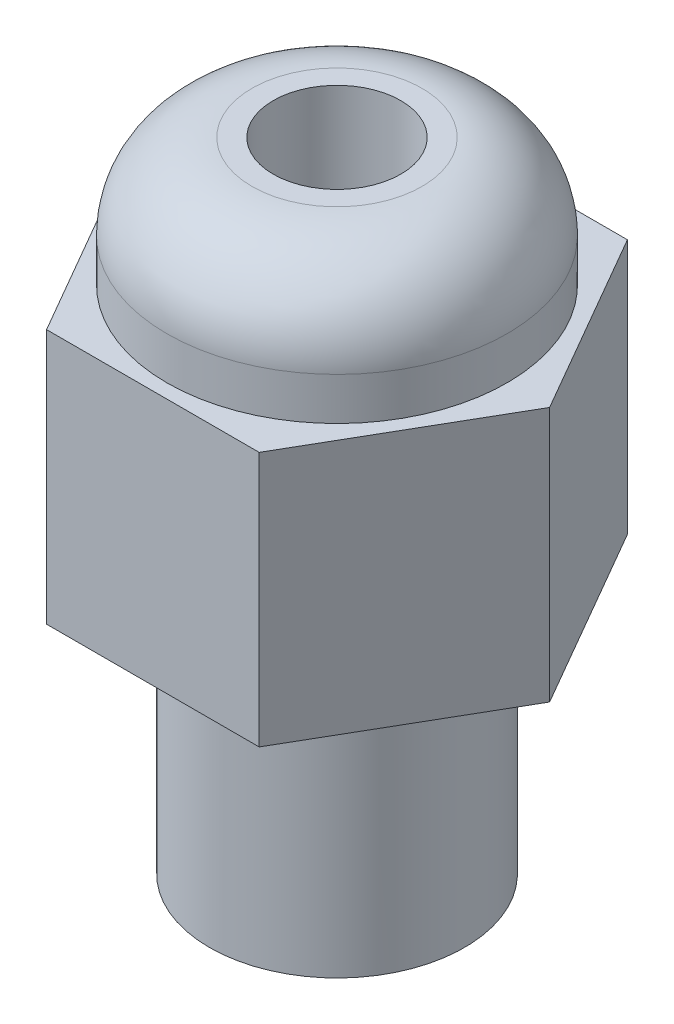
ISO-10303-21;
HEADER;
FILE_DESCRIPTION(('STEP AP214'),'2;1');
FILE_NAME('part.step','',(''),(''),'','','');
FILE_SCHEMA(('AUTOMOTIVE_DESIGN { 1 0 10303 214 1 1 1 1 }'));
ENDSEC;
DATA;
#1=APPLICATION_CONTEXT('core data for automotive mechanical design processes');
#2=APPLICATION_PROTOCOL_DEFINITION('international standard','automotive_design',2000,#1);
#3=PRODUCT_CONTEXT('',#1,'mechanical');
#4=PRODUCT('Part','Part','',(#3));
#5=PRODUCT_RELATED_PRODUCT_CATEGORY('part','',(#4));
#6=PRODUCT_DEFINITION_FORMATION('','',#4);
#7=PRODUCT_DEFINITION_CONTEXT('part definition',#1,'design');
#8=PRODUCT_DEFINITION('design','',#6,#7);
#9=PRODUCT_DEFINITION_SHAPE('','',#8);
#10=(LENGTH_UNIT() NAMED_UNIT(*) SI_UNIT(.MILLI.,.METRE.));
#11=(NAMED_UNIT(*) PLANE_ANGLE_UNIT() SI_UNIT($,.RADIAN.));
#12=(NAMED_UNIT(*) SI_UNIT($,.STERADIAN.) SOLID_ANGLE_UNIT());
#13=UNCERTAINTY_MEASURE_WITH_UNIT(LENGTH_MEASURE(1.E-05),#10,'distance_accuracy_value','');
#14=(GEOMETRIC_REPRESENTATION_CONTEXT(3) GLOBAL_UNCERTAINTY_ASSIGNED_CONTEXT((#13)) GLOBAL_UNIT_ASSIGNED_CONTEXT((#10,
#11,#12)) REPRESENTATION_CONTEXT('',''));
#15=CARTESIAN_POINT('',(0.,0.,0.));
#16=DIRECTION('',(0.,0.,1.));
#17=DIRECTION('',(1.,0.,0.));
#18=AXIS2_PLACEMENT_3D('',#15,#16,#17);
#19=CARTESIAN_POINT('',(0.,0.,0.));
#20=DIRECTION('',(0.,1.,0.));
#21=DIRECTION('',(0.,0.,1.));
#22=AXIS2_PLACEMENT_3D('',#19,#20,#21);
#23=PLANE('',#22);
#24=DIRECTION('',(0.499999999999995,0.,-0.866025403784441));
#25=VECTOR('',#24,1.);
#26=CARTESIAN_POINT('',(2.50000000000005,0.,4.33012701892216));
#27=LINE('',#26,#25);
#28=CARTESIAN_POINT('',(2.50000000000005,0.,4.33012701892216));
#29=VERTEX_POINT('',#28);
#30=CARTESIAN_POINT('',(4.99999999999999,0.,0.));
#31=VERTEX_POINT('',#30);
#32=EDGE_CURVE('E120',#29,#31,#27,.T.);
#33=ORIENTED_EDGE('',*,*,#32,.F.);
#34=DIRECTION('',(1.,0.,0.));
#35=VECTOR('',#34,1.);
#36=CARTESIAN_POINT('',(-2.49999999999995,0.,4.33012701892221));
#37=LINE('',#36,#35);
#38=CARTESIAN_POINT('',(-2.49999999999995,0.,4.33012701892221));
#39=VERTEX_POINT('',#38);
#40=EDGE_CURVE('E79',#39,#29,#37,.T.);
#41=ORIENTED_EDGE('',*,*,#40,.F.);
#42=DIRECTION('',(0.500000000000007,0.,0.866025403784435));
#43=VECTOR('',#42,1.);
#44=CARTESIAN_POINT('',(-4.99999999999999,0.,0.));
#45=LINE('',#44,#43);
#46=CARTESIAN_POINT('',(-4.99999999999999,0.,0.));
#47=VERTEX_POINT('',#46);
#48=EDGE_CURVE('E73',#47,#39,#45,.T.);
#49=ORIENTED_EDGE('',*,*,#48,.F.);
#50=DIRECTION('',(-0.499999999999995,0.,0.866025403784442));
#51=VECTOR('',#50,1.);
#52=CARTESIAN_POINT('',(-2.50000000000001,0.,-4.33012701892217));
#53=LINE('',#52,#51);
#54=CARTESIAN_POINT('',(-2.50000000000001,0.,-4.33012701892217));
#55=VERTEX_POINT('',#54);
#56=EDGE_CURVE('E110',#55,#47,#53,.T.);
#57=ORIENTED_EDGE('',*,*,#56,.F.);
#58=DIRECTION('',(-1.,0.,0.));
#59=VECTOR('',#58,1.);
#60=CARTESIAN_POINT('',(2.49999999999998,0.,-4.33012701892219));
#61=LINE('',#60,#59);
#62=CARTESIAN_POINT('',(2.49999999999998,0.,-4.33012701892219));
#63=VERTEX_POINT('',#62);
#64=EDGE_CURVE('E126',#63,#55,#61,.T.);
#65=ORIENTED_EDGE('',*,*,#64,.F.);
#66=DIRECTION('',(-0.500000000000001,0.,-0.866025403784438));
#67=VECTOR('',#66,1.);
#68=CARTESIAN_POINT('',(4.99999999999999,0.,0.));
#69=LINE('',#68,#67);
#70=EDGE_CURVE('E123',#31,#63,#69,.T.);
#71=ORIENTED_EDGE('',*,*,#70,.F.);
#72=EDGE_LOOP('',(#33,#41,#49,#57,#65,#71));
#73=FACE_BOUND('',#72,.T.);
#74=CARTESIAN_POINT('',(0.,0.,0.));
#75=DIRECTION('',(0.,1.,0.));
#76=DIRECTION('',(0.,0.,1.));
#77=AXIS2_PLACEMENT_3D('',#74,#75,#76);
#78=CIRCLE('',#77,3.);
#79=CARTESIAN_POINT('',(0.,0.,3.));
#80=VERTEX_POINT('',#79);
#81=EDGE_CURVE('E11',#80,#80,#78,.F.);
#82=ORIENTED_EDGE('',*,*,#81,.F.);
#83=EDGE_LOOP('',(#82));
#84=FACE_BOUND('',#83,.T.);
#85=ADVANCED_FACE('F33',(#73,#84),#23,.F.);
#86=CARTESIAN_POINT('',(0.,7.,0.));
#87=DIRECTION('',(0.,1.,0.));
#88=DIRECTION('',(0.,0.,1.));
#89=AXIS2_PLACEMENT_3D('',#86,#87,#88);
#90=DEGENERATE_TOROIDAL_SURFACE('',#89,2.,2.,.T.);
#91=CARTESIAN_POINT('',(0.,9.,0.));
#92=DIRECTION('',(0.,1.,0.));
#93=DIRECTION('',(0.,0.,1.));
#94=AXIS2_PLACEMENT_3D('',#91,#92,#93);
#95=CIRCLE('',#94,2.);
#96=CARTESIAN_POINT('',(0.,9.,2.));
#97=VERTEX_POINT('',#96);
#98=EDGE_CURVE('E140',#97,#97,#95,.T.);
#99=ORIENTED_EDGE('',*,*,#98,.F.);
#100=EDGE_LOOP('',(#99));
#101=FACE_BOUND('',#100,.T.);
#102=CARTESIAN_POINT('',(0.,7.,0.));
#103=DIRECTION('',(0.,1.,0.));
#104=DIRECTION('',(0.,0.,1.));
#105=AXIS2_PLACEMENT_3D('',#102,#103,#104);
#106=CIRCLE('',#105,4.);
#107=CARTESIAN_POINT('',(0.,7.,4.));
#108=VERTEX_POINT('',#107);
#109=EDGE_CURVE('E42',#108,#108,#106,.F.);
#110=ORIENTED_EDGE('',*,*,#109,.F.);
#111=EDGE_LOOP('',(#110));
#112=FACE_BOUND('',#111,.T.);
#113=ADVANCED_FACE('F35',(#101,#112),#90,.T.);
#114=CARTESIAN_POINT('',(0.,6.,0.));
#115=DIRECTION('',(0.,1.,0.));
#116=DIRECTION('',(0.,0.,1.));
#117=AXIS2_PLACEMENT_3D('',#114,#115,#116);
#118=PLANE('',#117);
#119=DIRECTION('',(0.499999999999995,0.,-0.866025403784441));
#120=VECTOR('',#119,1.);
#121=CARTESIAN_POINT('',(2.50000000000005,6.,4.33012701892216));
#122=LINE('',#121,#120);
#123=CARTESIAN_POINT('',(2.50000000000005,6.,4.33012701892216));
#124=VERTEX_POINT('',#123);
#125=CARTESIAN_POINT('',(4.99999999999999,6.,0.));
#126=VERTEX_POINT('',#125);
#127=EDGE_CURVE('E131',#124,#126,#122,.T.);
#128=ORIENTED_EDGE('',*,*,#127,.T.);
#129=DIRECTION('',(-0.500000000000001,0.,-0.866025403784438));
#130=VECTOR('',#129,1.);
#131=CARTESIAN_POINT('',(4.99999999999999,6.,0.));
#132=LINE('',#131,#130);
#133=CARTESIAN_POINT('',(2.49999999999998,6.,-4.33012701892219));
#134=VERTEX_POINT('',#133);
#135=EDGE_CURVE('E88',#126,#134,#132,.T.);
#136=ORIENTED_EDGE('',*,*,#135,.T.);
#137=DIRECTION('',(-1.,0.,0.));
#138=VECTOR('',#137,1.);
#139=CARTESIAN_POINT('',(2.49999999999998,6.,-4.33012701892219));
#140=LINE('',#139,#138);
#141=CARTESIAN_POINT('',(-2.50000000000001,6.,-4.33012701892217));
#142=VERTEX_POINT('',#141);
#143=EDGE_CURVE('E102',#134,#142,#140,.T.);
#144=ORIENTED_EDGE('',*,*,#143,.T.);
#145=DIRECTION('',(-0.499999999999995,0.,0.866025403784442));
#146=VECTOR('',#145,1.);
#147=CARTESIAN_POINT('',(-2.50000000000001,6.,-4.33012701892217));
#148=LINE('',#147,#146);
#149=CARTESIAN_POINT('',(-4.99999999999999,6.,0.));
#150=VERTEX_POINT('',#149);
#151=EDGE_CURVE('E95',#142,#150,#148,.T.);
#152=ORIENTED_EDGE('',*,*,#151,.T.);
#153=DIRECTION('',(0.500000000000007,0.,0.866025403784435));
#154=VECTOR('',#153,1.);
#155=CARTESIAN_POINT('',(-4.99999999999999,6.,0.));
#156=LINE('',#155,#154);
#157=CARTESIAN_POINT('',(-2.49999999999995,6.,4.33012701892221));
#158=VERTEX_POINT('',#157);
#159=EDGE_CURVE('E100',#150,#158,#156,.T.);
#160=ORIENTED_EDGE('',*,*,#159,.T.);
#161=DIRECTION('',(1.,0.,0.));
#162=VECTOR('',#161,1.);
#163=CARTESIAN_POINT('',(-2.49999999999995,6.,4.33012701892221));
#164=LINE('',#163,#162);
#165=EDGE_CURVE('E50',#158,#124,#164,.T.);
#166=ORIENTED_EDGE('',*,*,#165,.T.);
#167=EDGE_LOOP('',(#128,#136,#144,#152,#160,#166));
#168=FACE_BOUND('',#167,.T.);
#169=CARTESIAN_POINT('',(0.,6.,0.));
#170=DIRECTION('',(0.,1.,0.));
#171=DIRECTION('',(0.,0.,1.));
#172=AXIS2_PLACEMENT_3D('',#169,#170,#171);
#173=CIRCLE('',#172,4.);
#174=CARTESIAN_POINT('',(0.,6.,4.));
#175=VERTEX_POINT('',#174);
#176=EDGE_CURVE('E124',#175,#175,#173,.T.);
#177=ORIENTED_EDGE('',*,*,#176,.F.);
#178=EDGE_LOOP('',(#177));
#179=FACE_BOUND('',#178,.T.);
#180=ADVANCED_FACE('F97',(#168,#179),#118,.T.);
#181=CARTESIAN_POINT('',(2.50000000000005,6.,4.33012701892216));
#182=DIRECTION('',(-0.866025403784442,0.,-0.499999999999995));
#183=DIRECTION('',(-0.499999999999995,0.,0.866025403784442));
#184=AXIS2_PLACEMENT_3D('',#181,#182,#183);
#185=PLANE('',#184);
#186=ORIENTED_EDGE('',*,*,#32,.T.);
#187=DIRECTION('',(0.,-1.,0.));
#188=VECTOR('',#187,1.);
#189=CARTESIAN_POINT('',(4.99999999999999,6.,0.));
#190=LINE('',#189,#188);
#191=EDGE_CURVE('E138',#126,#31,#190,.T.);
#192=ORIENTED_EDGE('',*,*,#191,.F.);
#193=ORIENTED_EDGE('',*,*,#127,.F.);
#194=DIRECTION('',(0.,-1.,0.));
#195=VECTOR('',#194,1.);
#196=CARTESIAN_POINT('',(2.50000000000005,6.,4.33012701892216));
#197=LINE('',#196,#195);
#198=EDGE_CURVE('E116',#124,#29,#197,.T.);
#199=ORIENTED_EDGE('',*,*,#198,.T.);
#200=EDGE_LOOP('',(#186,#192,#193,#199));
#201=FACE_BOUND('',#200,.T.);
#202=ADVANCED_FACE('F154',(#201),#185,.F.);
#203=CARTESIAN_POINT('',(4.99999999999999,6.,0.));
#204=DIRECTION('',(-0.866025403784438,0.,0.500000000000001));
#205=DIRECTION('',(0.500000000000001,0.,0.866025403784438));
#206=AXIS2_PLACEMENT_3D('',#203,#204,#205);
#207=PLANE('',#206);
#208=ORIENTED_EDGE('',*,*,#70,.T.);
#209=DIRECTION('',(0.,-1.,0.));
#210=VECTOR('',#209,1.);
#211=CARTESIAN_POINT('',(2.49999999999998,6.,-4.33012701892219));
#212=LINE('',#211,#210);
#213=EDGE_CURVE('E135',#134,#63,#212,.T.);
#214=ORIENTED_EDGE('',*,*,#213,.F.);
#215=ORIENTED_EDGE('',*,*,#135,.F.);
#216=ORIENTED_EDGE('',*,*,#191,.T.);
#217=EDGE_LOOP('',(#208,#214,#215,#216));
#218=FACE_BOUND('',#217,.T.);
#219=ADVANCED_FACE('F181',(#218),#207,.F.);
#220=CARTESIAN_POINT('',(2.49999999999998,6.,-4.33012701892219));
#221=DIRECTION('',(0.,0.,1.));
#222=DIRECTION('',(1.,0.,0.));
#223=AXIS2_PLACEMENT_3D('',#220,#221,#222);
#224=PLANE('',#223);
#225=ORIENTED_EDGE('',*,*,#64,.T.);
#226=DIRECTION('',(0.,-1.,0.));
#227=VECTOR('',#226,1.);
#228=CARTESIAN_POINT('',(-2.50000000000001,6.,-4.33012701892217));
#229=LINE('',#228,#227);
#230=EDGE_CURVE('E111',#142,#55,#229,.T.);
#231=ORIENTED_EDGE('',*,*,#230,.F.);
#232=ORIENTED_EDGE('',*,*,#143,.F.);
#233=ORIENTED_EDGE('',*,*,#213,.T.);
#234=EDGE_LOOP('',(#225,#231,#232,#233));
#235=FACE_BOUND('',#234,.T.);
#236=ADVANCED_FACE('F184',(#235),#224,.F.);
#237=CARTESIAN_POINT('',(-2.50000000000001,6.,-4.33012701892217));
#238=DIRECTION('',(0.866025403784441,0.,0.499999999999995));
#239=DIRECTION('',(0.499999999999995,0.,-0.866025403784442));
#240=AXIS2_PLACEMENT_3D('',#237,#238,#239);
#241=PLANE('',#240);
#242=ORIENTED_EDGE('',*,*,#56,.T.);
#243=DIRECTION('',(0.,-1.,0.));
#244=VECTOR('',#243,1.);
#245=CARTESIAN_POINT('',(-4.99999999999999,6.,0.));
#246=LINE('',#245,#244);
#247=EDGE_CURVE('E107',#150,#47,#246,.T.);
#248=ORIENTED_EDGE('',*,*,#247,.F.);
#249=ORIENTED_EDGE('',*,*,#151,.F.);
#250=ORIENTED_EDGE('',*,*,#230,.T.);
#251=EDGE_LOOP('',(#242,#248,#249,#250));
#252=FACE_BOUND('',#251,.T.);
#253=ADVANCED_FACE('F108',(#252),#241,.F.);
#254=CARTESIAN_POINT('',(-4.99999999999999,6.,0.));
#255=DIRECTION('',(0.866025403784434,0.,-0.500000000000007));
#256=DIRECTION('',(-0.500000000000007,0.,-0.866025403784435));
#257=AXIS2_PLACEMENT_3D('',#254,#255,#256);
#258=PLANE('',#257);
#259=ORIENTED_EDGE('',*,*,#48,.T.);
#260=DIRECTION('',(0.,-1.,0.));
#261=VECTOR('',#260,1.);
#262=CARTESIAN_POINT('',(-2.49999999999995,6.,4.33012701892221));
#263=LINE('',#262,#261);
#264=EDGE_CURVE('E112',#158,#39,#263,.T.);
#265=ORIENTED_EDGE('',*,*,#264,.F.);
#266=ORIENTED_EDGE('',*,*,#159,.F.);
#267=ORIENTED_EDGE('',*,*,#247,.T.);
#268=EDGE_LOOP('',(#259,#265,#266,#267));
#269=FACE_BOUND('',#268,.T.);
#270=ADVANCED_FACE('F114',(#269),#258,.F.);
#271=CARTESIAN_POINT('',(-2.49999999999995,6.,4.33012701892221));
#272=DIRECTION('',(0.,0.,-1.));
#273=DIRECTION('',(-1.,0.,0.));
#274=AXIS2_PLACEMENT_3D('',#271,#272,#273);
#275=PLANE('',#274);
#276=ORIENTED_EDGE('',*,*,#40,.T.);
#277=ORIENTED_EDGE('',*,*,#198,.F.);
#278=ORIENTED_EDGE('',*,*,#165,.F.);
#279=ORIENTED_EDGE('',*,*,#264,.T.);
#280=EDGE_LOOP('',(#276,#277,#278,#279));
#281=FACE_BOUND('',#280,.T.);
#282=ADVANCED_FACE('F188',(#281),#275,.F.);
#283=CARTESIAN_POINT('',(0.,6.,0.));
#284=DIRECTION('',(0.,-1.,0.));
#285=DIRECTION('',(0.,0.,-1.));
#286=AXIS2_PLACEMENT_3D('',#283,#284,#285);
#287=CYLINDRICAL_SURFACE('',#286,1.5);
#288=CARTESIAN_POINT('',(0.,9.,0.));
#289=DIRECTION('',(0.,1.,0.));
#290=DIRECTION('',(0.,0.,1.));
#291=AXIS2_PLACEMENT_3D('',#288,#289,#290);
#292=CIRCLE('',#291,1.5);
#293=CARTESIAN_POINT('',(0.,9.,1.5));
#294=VERTEX_POINT('',#293);
#295=EDGE_CURVE('E167',#294,#294,#292,.T.);
#296=ORIENTED_EDGE('',*,*,#295,.T.);
#297=EDGE_LOOP('',(#296));
#298=FACE_BOUND('',#297,.T.);
#299=CARTESIAN_POINT('',(0.,-6.,0.));
#300=DIRECTION('',(0.,-1.,0.));
#301=DIRECTION('',(0.,0.,-1.));
#302=AXIS2_PLACEMENT_3D('',#299,#300,#301);
#303=CIRCLE('',#302,1.5);
#304=CARTESIAN_POINT('',(0.,-6.,-1.5));
#305=VERTEX_POINT('',#304);
#306=EDGE_CURVE('E174',#305,#305,#303,.T.);
#307=ORIENTED_EDGE('',*,*,#306,.T.);
#308=EDGE_LOOP('',(#307));
#309=FACE_BOUND('',#308,.T.);
#310=ADVANCED_FACE('F163',(#298,#309),#287,.F.);
#311=CARTESIAN_POINT('',(0.,9.,0.));
#312=DIRECTION('',(0.,1.,0.));
#313=DIRECTION('',(0.,0.,1.));
#314=AXIS2_PLACEMENT_3D('',#311,#312,#313);
#315=PLANE('',#314);
#316=ORIENTED_EDGE('',*,*,#98,.T.);
#317=EDGE_LOOP('',(#316));
#318=FACE_BOUND('',#317,.T.);
#319=ORIENTED_EDGE('',*,*,#295,.F.);
#320=EDGE_LOOP('',(#319));
#321=FACE_BOUND('',#320,.T.);
#322=ADVANCED_FACE('F160',(#318,#321),#315,.T.);
#323=CARTESIAN_POINT('',(0.,9.,0.));
#324=DIRECTION('',(0.,-1.,0.));
#325=DIRECTION('',(0.,0.,-1.));
#326=AXIS2_PLACEMENT_3D('',#323,#324,#325);
#327=CYLINDRICAL_SURFACE('',#326,4.);
#328=ORIENTED_EDGE('',*,*,#109,.T.);
#329=EDGE_LOOP('',(#328));
#330=FACE_BOUND('',#329,.T.);
#331=ORIENTED_EDGE('',*,*,#176,.T.);
#332=EDGE_LOOP('',(#331));
#333=FACE_BOUND('',#332,.T.);
#334=ADVANCED_FACE('F145',(#330,#333),#327,.T.);
#335=CARTESIAN_POINT('',(0.,-6.,0.));
#336=DIRECTION('',(0.,-1.,0.));
#337=DIRECTION('',(0.,0.,-1.));
#338=AXIS2_PLACEMENT_3D('',#335,#336,#337);
#339=PLANE('',#338);
#340=CARTESIAN_POINT('',(0.,-6.,0.));
#341=DIRECTION('',(0.,-1.,0.));
#342=DIRECTION('',(0.,0.,-1.));
#343=AXIS2_PLACEMENT_3D('',#340,#341,#342);
#344=CIRCLE('',#343,3.);
#345=CARTESIAN_POINT('',(0.,-6.,-3.));
#346=VERTEX_POINT('',#345);
#347=EDGE_CURVE('E169',#346,#346,#344,.T.);
#348=ORIENTED_EDGE('',*,*,#347,.T.);
#349=EDGE_LOOP('',(#348));
#350=FACE_BOUND('',#349,.T.);
#351=ORIENTED_EDGE('',*,*,#306,.F.);
#352=EDGE_LOOP('',(#351));
#353=FACE_BOUND('',#352,.T.);
#354=ADVANCED_FACE('F254',(#350,#353),#339,.T.);
#355=CARTESIAN_POINT('',(0.,-6.,0.));
#356=DIRECTION('',(0.,1.,0.));
#357=DIRECTION('',(0.,0.,1.));
#358=AXIS2_PLACEMENT_3D('',#355,#356,#357);
#359=CYLINDRICAL_SURFACE('',#358,3.);
#360=ORIENTED_EDGE('',*,*,#347,.F.);
#361=EDGE_LOOP('',(#360));
#362=FACE_BOUND('',#361,.T.);
#363=ORIENTED_EDGE('',*,*,#81,.T.);
#364=EDGE_LOOP('',(#363));
#365=FACE_BOUND('',#364,.T.);
#366=ADVANCED_FACE('F274',(#362,#365),#359,.T.);
#367=CLOSED_SHELL('',(#85,#113,#180,#202,#219,#236,#253,#270,#282,#310,#322,#334,#354,#366));
#368=MANIFOLD_SOLID_BREP('B2',#367);
#369=ADVANCED_BREP_SHAPE_REPRESENTATION('',(#18,#368),#14);
#370=SHAPE_DEFINITION_REPRESENTATION(#9,#369);
ENDSEC;
END-ISO-10303-21;
